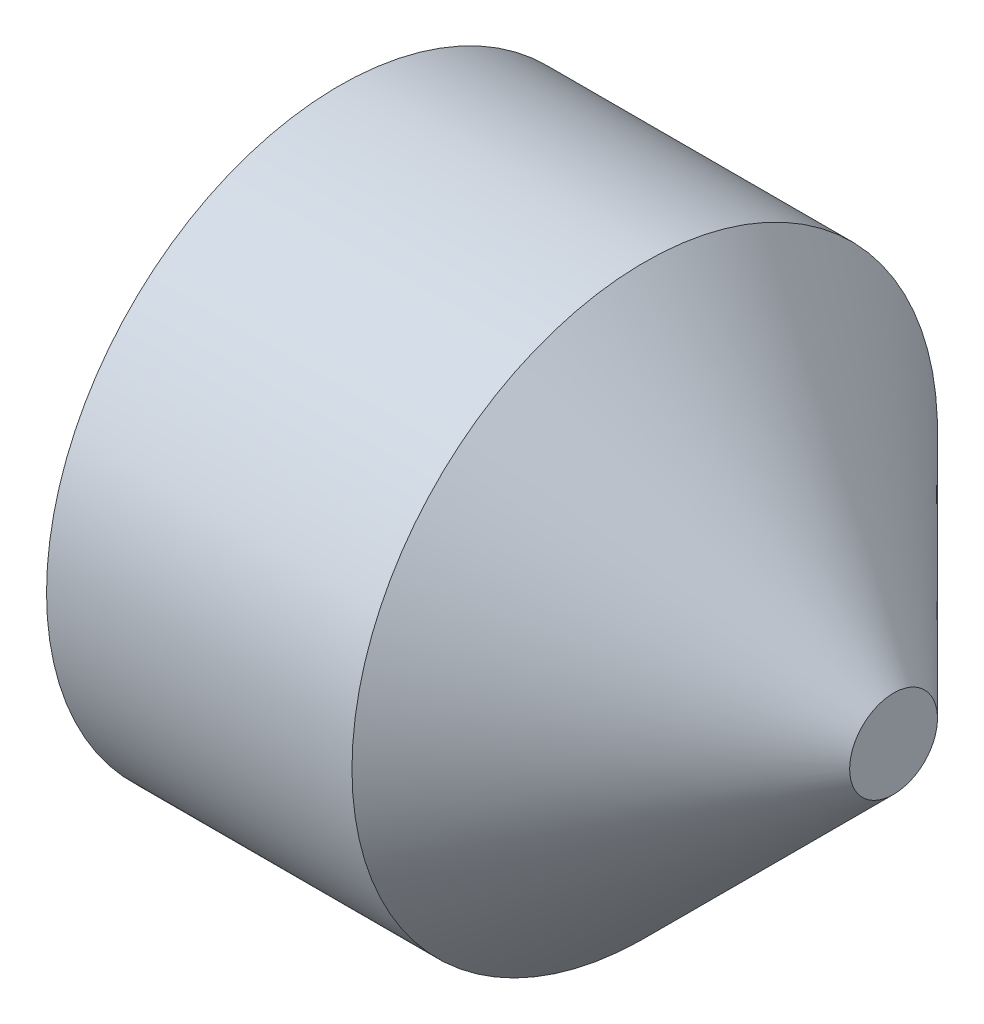
ISO-10303-21;
HEADER;
FILE_DESCRIPTION(('STEP AP214'),'2;1');
FILE_NAME('part.step','',(''),(''),'','','');
FILE_SCHEMA(('AUTOMOTIVE_DESIGN { 1 0 10303 214 1 1 1 1 }'));
ENDSEC;
DATA;
#1=APPLICATION_CONTEXT('core data for automotive mechanical design processes');
#2=APPLICATION_PROTOCOL_DEFINITION('international standard','automotive_design',2000,#1);
#3=PRODUCT_CONTEXT('',#1,'mechanical');
#4=PRODUCT('Part','Part','',(#3));
#5=PRODUCT_RELATED_PRODUCT_CATEGORY('part','',(#4));
#6=PRODUCT_DEFINITION_FORMATION('','',#4);
#7=PRODUCT_DEFINITION_CONTEXT('part definition',#1,'design');
#8=PRODUCT_DEFINITION('design','',#6,#7);
#9=PRODUCT_DEFINITION_SHAPE('','',#8);
#10=(LENGTH_UNIT() NAMED_UNIT(*) SI_UNIT(.MILLI.,.METRE.));
#11=(NAMED_UNIT(*) PLANE_ANGLE_UNIT() SI_UNIT($,.RADIAN.));
#12=(NAMED_UNIT(*) SI_UNIT($,.STERADIAN.) SOLID_ANGLE_UNIT());
#13=UNCERTAINTY_MEASURE_WITH_UNIT(LENGTH_MEASURE(1.E-05),#10,'distance_accuracy_value','');
#14=(GEOMETRIC_REPRESENTATION_CONTEXT(3) GLOBAL_UNCERTAINTY_ASSIGNED_CONTEXT((#13)) GLOBAL_UNIT_ASSIGNED_CONTEXT((#10,
#11,#12)) REPRESENTATION_CONTEXT('',''));
#15=CARTESIAN_POINT('',(0.,0.,0.));
#16=DIRECTION('',(0.,0.,1.));
#17=DIRECTION('',(1.,0.,0.));
#18=AXIS2_PLACEMENT_3D('',#15,#16,#17);
#19=CARTESIAN_POINT('',(0.,0.,0.));
#20=DIRECTION('',(-1.,0.,0.));
#21=DIRECTION('',(0.,0.,1.));
#22=AXIS2_PLACEMENT_3D('',#19,#20,#21);
#23=PLANE('',#22);
#24=CARTESIAN_POINT('',(0.,0.,0.));
#25=DIRECTION('',(-1.,0.,0.));
#26=DIRECTION('',(0.,0.,1.));
#27=AXIS2_PLACEMENT_3D('',#24,#25,#26);
#28=CIRCLE('',#27,2.4455);
#29=CARTESIAN_POINT('',(0.,0.,2.4455));
#30=VERTEX_POINT('',#29);
#31=EDGE_CURVE('E137',#30,#30,#28,.T.);
#32=ORIENTED_EDGE('',*,*,#31,.T.);
#33=EDGE_LOOP('',(#32));
#34=FACE_BOUND('',#33,.T.);
#35=DIRECTION('',(0.,0.,-1.));
#36=VECTOR('',#35,1.);
#37=CARTESIAN_POINT('',(0.,1.5,0.866025403784437));
#38=LINE('',#37,#36);
#39=CARTESIAN_POINT('',(0.,1.5,0.866025403784437));
#40=VERTEX_POINT('',#39);
#41=CARTESIAN_POINT('',(0.,1.5,-0.866025403784441));
#42=VERTEX_POINT('',#41);
#43=EDGE_CURVE('E128',#40,#42,#38,.T.);
#44=ORIENTED_EDGE('',*,*,#43,.F.);
#45=DIRECTION('',(0.,-0.866025403784439,0.5));
#46=VECTOR('',#45,1.);
#47=CARTESIAN_POINT('',(0.,1.5,0.866025403784437));
#48=LINE('',#47,#46);
#49=CARTESIAN_POINT('',(0.,0.,1.73205080756888));
#50=VERTEX_POINT('',#49);
#51=EDGE_CURVE('E50',#40,#50,#48,.T.);
#52=ORIENTED_EDGE('',*,*,#51,.T.);
#53=DIRECTION('',(0.,0.866025403784439,0.5));
#54=VECTOR('',#53,1.);
#55=CARTESIAN_POINT('',(0.,-1.5,0.866025403784437));
#56=LINE('',#55,#54);
#57=CARTESIAN_POINT('',(0.,-1.5,0.866025403784437));
#58=VERTEX_POINT('',#57);
#59=EDGE_CURVE('E119',#58,#50,#56,.T.);
#60=ORIENTED_EDGE('',*,*,#59,.F.);
#61=DIRECTION('',(0.,0.,-1.));
#62=VECTOR('',#61,1.);
#63=CARTESIAN_POINT('',(0.,-1.5,0.866025403784437));
#64=LINE('',#63,#62);
#65=CARTESIAN_POINT('',(0.,-1.5,-0.86602540378444));
#66=VERTEX_POINT('',#65);
#67=EDGE_CURVE('E122',#58,#66,#64,.T.);
#68=ORIENTED_EDGE('',*,*,#67,.T.);
#69=DIRECTION('',(0.,0.866025403784439,-0.5));
#70=VECTOR('',#69,1.);
#71=CARTESIAN_POINT('',(0.,-1.5,-0.86602540378444));
#72=LINE('',#71,#70);
#73=CARTESIAN_POINT('',(0.,0.,-1.73205080756888));
#74=VERTEX_POINT('',#73);
#75=EDGE_CURVE('E125',#66,#74,#72,.T.);
#76=ORIENTED_EDGE('',*,*,#75,.T.);
#77=DIRECTION('',(0.,-0.866025403784439,-0.5));
#78=VECTOR('',#77,1.);
#79=CARTESIAN_POINT('',(0.,1.5,-0.866025403784441));
#80=LINE('',#79,#78);
#81=EDGE_CURVE('E108',#42,#74,#80,.T.);
#82=ORIENTED_EDGE('',*,*,#81,.F.);
#83=EDGE_LOOP('',(#44,#52,#60,#68,#76,#82));
#84=FACE_BOUND('',#83,.T.);
#85=ADVANCED_FACE('F35',(#34,#84),#23,.T.);
#86=CARTESIAN_POINT('',(6.,0.45,0.));
#87=DIRECTION('',(1.,0.,0.));
#88=DIRECTION('',(0.,0.,-1.));
#89=AXIS2_PLACEMENT_3D('',#86,#87,#88);
#90=PLANE('',#89);
#91=CARTESIAN_POINT('',(6.,0.,0.));
#92=DIRECTION('',(-1.,0.,0.));
#93=DIRECTION('',(0.,0.,1.));
#94=AXIS2_PLACEMENT_3D('',#91,#92,#93);
#95=CIRCLE('',#94,0.45);
#96=CARTESIAN_POINT('',(6.,0.,0.449999999999999));
#97=VERTEX_POINT('',#96);
#98=EDGE_CURVE('E11',#97,#97,#95,.T.);
#99=ORIENTED_EDGE('',*,*,#98,.F.);
#100=EDGE_LOOP('',(#99));
#101=FACE_BOUND('',#100,.T.);
#102=ADVANCED_FACE('F37',(#101),#90,.T.);
#103=CARTESIAN_POINT('',(3.44999999999999,0.,0.));
#104=DIRECTION('',(-1.,0.,0.));
#105=DIRECTION('',(0.,0.,1.));
#106=AXIS2_PLACEMENT_3D('',#103,#104,#105);
#107=CONICAL_SURFACE('',#106,3.,0.785398163397447);
#108=CARTESIAN_POINT('',(3.44999999999999,0.,0.));
#109=DIRECTION('',(-1.,0.,0.));
#110=DIRECTION('',(0.,0.,1.));
#111=AXIS2_PLACEMENT_3D('',#108,#109,#110);
#112=CIRCLE('',#111,3.);
#113=CARTESIAN_POINT('',(3.44999999999999,0.,3.));
#114=VERTEX_POINT('',#113);
#115=EDGE_CURVE('E43',#114,#114,#112,.T.);
#116=CARTESIAN_POINT('',(6.,0.,0.449999999999999));
#117=CARTESIAN_POINT('',(5.9734375,0.,0.476562499999999));
#118=CARTESIAN_POINT('',(5.946875,0.,0.503124999999999));
#119=CARTESIAN_POINT('',(5.89375,0.,0.556249999999999));
#120=CARTESIAN_POINT('',(5.8671875,0.,0.582812499999999));
#121=CARTESIAN_POINT('',(5.8140625,0.,0.635937499999999));
#122=CARTESIAN_POINT('',(5.7875,0.,0.662499999999999));
#123=CARTESIAN_POINT('',(5.734375,0.,0.715624999999999));
#124=CARTESIAN_POINT('',(5.7078125,0.,0.742187499999999));
#125=CARTESIAN_POINT('',(5.6546875,0.,0.795312499999999));
#126=CARTESIAN_POINT('',(5.628125,0.,0.821874999999999));
#127=CARTESIAN_POINT('',(5.575,0.,0.874999999999999));
#128=CARTESIAN_POINT('',(5.5484375,0.,0.901562499999999));
#129=CARTESIAN_POINT('',(5.4953125,0.,0.954687499999999));
#130=CARTESIAN_POINT('',(5.46875,0.,0.981249999999999));
#131=CARTESIAN_POINT('',(5.415625,0.,1.034375));
#132=CARTESIAN_POINT('',(5.3890625,0.,1.0609375));
#133=CARTESIAN_POINT('',(5.3359375,0.,1.1140625));
#134=CARTESIAN_POINT('',(5.309375,0.,1.140625));
#135=CARTESIAN_POINT('',(5.25625,0.,1.19375));
#136=CARTESIAN_POINT('',(5.2296875,0.,1.2203125));
#137=CARTESIAN_POINT('',(5.1765625,0.,1.2734375));
#138=CARTESIAN_POINT('',(5.15,0.,1.3));
#139=CARTESIAN_POINT('',(5.096875,0.,1.353125));
#140=CARTESIAN_POINT('',(5.0703125,0.,1.3796875));
#141=CARTESIAN_POINT('',(5.0171875,0.,1.4328125));
#142=CARTESIAN_POINT('',(4.990625,0.,1.459375));
#143=CARTESIAN_POINT('',(4.9375,0.,1.5125));
#144=CARTESIAN_POINT('',(4.9109375,0.,1.5390625));
#145=CARTESIAN_POINT('',(4.8578125,0.,1.5921875));
#146=CARTESIAN_POINT('',(4.83125,0.,1.61875));
#147=CARTESIAN_POINT('',(4.778125,0.,1.671875));
#148=CARTESIAN_POINT('',(4.7515625,0.,1.6984375));
#149=CARTESIAN_POINT('',(4.6984375,0.,1.7515625));
#150=CARTESIAN_POINT('',(4.671875,0.,1.778125));
#151=CARTESIAN_POINT('',(4.61875,0.,1.83125));
#152=CARTESIAN_POINT('',(4.59218749999999,0.,1.8578125));
#153=CARTESIAN_POINT('',(4.5390625,0.,1.9109375));
#154=CARTESIAN_POINT('',(4.51249999999999,0.,1.9375));
#155=CARTESIAN_POINT('',(4.45937499999999,0.,1.990625));
#156=CARTESIAN_POINT('',(4.43281249999999,0.,2.0171875));
#157=CARTESIAN_POINT('',(4.37968749999999,0.,2.0703125));
#158=CARTESIAN_POINT('',(4.35312499999999,0.,2.096875));
#159=CARTESIAN_POINT('',(4.29999999999999,0.,2.15));
#160=CARTESIAN_POINT('',(4.27343749999999,0.,2.1765625));
#161=CARTESIAN_POINT('',(4.22031249999999,0.,2.2296875));
#162=CARTESIAN_POINT('',(4.19374999999999,0.,2.25625));
#163=CARTESIAN_POINT('',(4.14062499999999,0.,2.309375));
#164=CARTESIAN_POINT('',(4.11406249999999,0.,2.3359375));
#165=CARTESIAN_POINT('',(4.06093749999999,0.,2.3890625));
#166=CARTESIAN_POINT('',(4.03437499999999,0.,2.415625));
#167=CARTESIAN_POINT('',(3.98124999999999,0.,2.46875));
#168=CARTESIAN_POINT('',(3.95468749999999,0.,2.4953125));
#169=CARTESIAN_POINT('',(3.90156249999999,0.,2.5484375));
#170=CARTESIAN_POINT('',(3.87499999999999,0.,2.575));
#171=CARTESIAN_POINT('',(3.82187499999999,0.,2.628125));
#172=CARTESIAN_POINT('',(3.79531249999999,0.,2.6546875));
#173=CARTESIAN_POINT('',(3.74218749999999,0.,2.7078125));
#174=CARTESIAN_POINT('',(3.71562499999999,0.,2.734375));
#175=CARTESIAN_POINT('',(3.66249999999999,0.,2.7875));
#176=CARTESIAN_POINT('',(3.63593749999999,0.,2.8140625));
#177=CARTESIAN_POINT('',(3.58281249999999,0.,2.8671875));
#178=CARTESIAN_POINT('',(3.55624999999999,0.,2.89375));
#179=CARTESIAN_POINT('',(3.50312499999999,0.,2.946875));
#180=CARTESIAN_POINT('',(3.47656249999999,0.,2.9734375));
#181=CARTESIAN_POINT('',(3.44999999999999,0.,3.));
#182=B_SPLINE_CURVE_WITH_KNOTS('',3,(#116,#117,#118,#119,#120,#121,#122,#123,#124,#125,#126,
#127,#128,#129,#130,#131,#132,#133,#134,#135,#136,#137,#138,#139,#140,#141,#142,#143,#144,#145,
#146,#147,#148,#149,#150,#151,#152,#153,#154,#155,#156,#157,#158,#159,#160,#161,#162,#163,#164,
#165,#166,#167,#168,#169,#170,#171,#172,#173,#174,#175,#176,#177,#178,#179,#180,#181),
.UNSPECIFIED.,.F.,.F.,(4,2,2,2,2,2,2,2,2,2,2,2,2,2,2,2,2,2,2,2,2,2,2,2,2,2,2,2,2,2,2,2,4),(0.,
0.112695143251606,0.225390286503213,0.338085429754818,0.450780573006424,0.563475716258031,
0.676170859509638,0.788866002761244,0.901561146012849,1.01425628926446,1.12695143251606,
1.23964657576767,1.35234171901927,1.46503686227088,1.57773200552249,1.69042714877409,
1.8031222920257,1.91581743527731,2.02851257852891,2.14120772178052,2.25390286503212,
2.36659800828373,2.47929315153534,2.59198829478694,2.70468343803855,2.81737858129016,
2.93007372454176,3.04276886779337,3.15546401104497,3.26815915429658,3.38085429754819,
3.49354944079979,3.6062445840514),.UNSPECIFIED.);
#183=EDGE_CURVE('BSEAM148',#97,#114,#182,.T.);
#184=ORIENTED_EDGE('',*,*,#98,.T.);
#185=ORIENTED_EDGE('',*,*,#115,.F.);
#186=ORIENTED_EDGE('',*,*,#183,.T.);
#187=ORIENTED_EDGE('',*,*,#183,.F.);
#188=EDGE_LOOP('',(#184,#186,#185,#187));
#189=FACE_BOUND('',#188,.T.);
#190=ADVANCED_FACE('F148',(#189),#107,.T.);
#191=CARTESIAN_POINT('',(-12.7,0.,0.));
#192=DIRECTION('',(-1.,0.,0.));
#193=DIRECTION('',(0.,0.,1.));
#194=AXIS2_PLACEMENT_3D('',#191,#192,#193);
#195=CYLINDRICAL_SURFACE('',#194,3.);
#196=ORIENTED_EDGE('',*,*,#115,.T.);
#197=EDGE_LOOP('',(#196));
#198=FACE_BOUND('',#197,.T.);
#199=CARTESIAN_POINT('',(0.320140724265646,0.,0.));
#200=DIRECTION('',(-1.,0.,0.));
#201=DIRECTION('',(0.,0.,1.));
#202=AXIS2_PLACEMENT_3D('',#199,#200,#201);
#203=CIRCLE('',#202,3.);
#204=CARTESIAN_POINT('',(0.320140724265646,0.,3.));
#205=VERTEX_POINT('',#204);
#206=EDGE_CURVE('E140',#205,#205,#203,.T.);
#207=ORIENTED_EDGE('',*,*,#206,.F.);
#208=EDGE_LOOP('',(#207));
#209=FACE_BOUND('',#208,.T.);
#210=ADVANCED_FACE('F145',(#198,#209),#195,.T.);
#211=CARTESIAN_POINT('',(0.,0.,0.));
#212=DIRECTION('',(1.,0.,0.));
#213=DIRECTION('',(0.,0.,-1.));
#214=AXIS2_PLACEMENT_3D('',#211,#212,#213);
#215=CONICAL_SURFACE('',#214,2.4455,1.0471975511966);
#216=ORIENTED_EDGE('',*,*,#206,.T.);
#217=EDGE_LOOP('',(#216));
#218=FACE_BOUND('',#217,.T.);
#219=ORIENTED_EDGE('',*,*,#31,.F.);
#220=EDGE_LOOP('',(#219));
#221=FACE_BOUND('',#220,.T.);
#222=ADVANCED_FACE('F155',(#218,#221),#215,.T.);
#223=CARTESIAN_POINT('',(3.5,1.5,0.866025403784437));
#224=DIRECTION('',(0.,-0.5,-0.866025403784438));
#225=DIRECTION('',(0.,0.866025403784439,-0.5));
#226=AXIS2_PLACEMENT_3D('',#223,#224,#225);
#227=PLANE('',#226);
#228=ORIENTED_EDGE('',*,*,#51,.F.);
#229=DIRECTION('',(-1.,0.,0.));
#230=VECTOR('',#229,1.);
#231=CARTESIAN_POINT('',(3.5,1.5,0.866025403784437));
#232=LINE('',#231,#230);
#233=CARTESIAN_POINT('',(3.5,1.5,0.866025403784437));
#234=VERTEX_POINT('',#233);
#235=EDGE_CURVE('E55',#234,#40,#232,.T.);
#236=ORIENTED_EDGE('',*,*,#235,.F.);
#237=DIRECTION('',(0.,-0.866025403784439,0.5));
#238=VECTOR('',#237,1.);
#239=CARTESIAN_POINT('',(3.5,1.5,0.866025403784437));
#240=LINE('',#239,#238);
#241=CARTESIAN_POINT('',(3.5,0.,1.73205080756888));
#242=VERTEX_POINT('',#241);
#243=EDGE_CURVE('E82',#234,#242,#240,.T.);
#244=ORIENTED_EDGE('',*,*,#243,.T.);
#245=DIRECTION('',(-1.,0.,0.));
#246=VECTOR('',#245,1.);
#247=CARTESIAN_POINT('',(3.5,0.,1.73205080756888));
#248=LINE('',#247,#246);
#249=EDGE_CURVE('E135',#242,#50,#248,.T.);
#250=ORIENTED_EDGE('',*,*,#249,.T.);
#251=EDGE_LOOP('',(#228,#236,#244,#250));
#252=FACE_BOUND('',#251,.T.);
#253=ADVANCED_FACE('F166',(#252),#227,.T.);
#254=CARTESIAN_POINT('',(3.5,-1.5,0.866025403784437));
#255=DIRECTION('',(0.,-0.5,0.866025403784439));
#256=DIRECTION('',(0.,-0.866025403784439,-0.5));
#257=AXIS2_PLACEMENT_3D('',#254,#255,#256);
#258=PLANE('',#257);
#259=ORIENTED_EDGE('',*,*,#59,.T.);
#260=ORIENTED_EDGE('',*,*,#249,.F.);
#261=DIRECTION('',(0.,0.866025403784439,0.5));
#262=VECTOR('',#261,1.);
#263=CARTESIAN_POINT('',(3.5,-1.5,0.866025403784437));
#264=LINE('',#263,#262);
#265=CARTESIAN_POINT('',(3.5,-1.5,0.866025403784437));
#266=VERTEX_POINT('',#265);
#267=EDGE_CURVE('E266',#266,#242,#264,.T.);
#268=ORIENTED_EDGE('',*,*,#267,.F.);
#269=DIRECTION('',(-1.,0.,0.));
#270=VECTOR('',#269,1.);
#271=CARTESIAN_POINT('',(3.5,-1.5,0.866025403784437));
#272=LINE('',#271,#270);
#273=EDGE_CURVE('E133',#266,#58,#272,.T.);
#274=ORIENTED_EDGE('',*,*,#273,.T.);
#275=EDGE_LOOP('',(#259,#260,#268,#274));
#276=FACE_BOUND('',#275,.T.);
#277=ADVANCED_FACE('F173',(#276),#258,.F.);
#278=CARTESIAN_POINT('',(3.5,-1.5,0.866025403784437));
#279=DIRECTION('',(0.,1.,0.));
#280=DIRECTION('',(0.,0.,1.));
#281=AXIS2_PLACEMENT_3D('',#278,#279,#280);
#282=PLANE('',#281);
#283=ORIENTED_EDGE('',*,*,#67,.F.);
#284=ORIENTED_EDGE('',*,*,#273,.F.);
#285=DIRECTION('',(0.,0.,-1.));
#286=VECTOR('',#285,1.);
#287=CARTESIAN_POINT('',(3.5,-1.5,0.866025403784437));
#288=LINE('',#287,#286);
#289=CARTESIAN_POINT('',(3.5,-1.5,-0.86602540378444));
#290=VERTEX_POINT('',#289);
#291=EDGE_CURVE('E103',#266,#290,#288,.T.);
#292=ORIENTED_EDGE('',*,*,#291,.T.);
#293=DIRECTION('',(-1.,0.,0.));
#294=VECTOR('',#293,1.);
#295=CARTESIAN_POINT('',(3.5,-1.5,-0.86602540378444));
#296=LINE('',#295,#294);
#297=EDGE_CURVE('E98',#290,#66,#296,.T.);
#298=ORIENTED_EDGE('',*,*,#297,.T.);
#299=EDGE_LOOP('',(#283,#284,#292,#298));
#300=FACE_BOUND('',#299,.T.);
#301=ADVANCED_FACE('F180',(#300),#282,.T.);
#302=CARTESIAN_POINT('',(3.5,-1.5,-0.86602540378444));
#303=DIRECTION('',(0.,0.5,0.866025403784439));
#304=DIRECTION('',(0.,-0.866025403784439,0.5));
#305=AXIS2_PLACEMENT_3D('',#302,#303,#304);
#306=PLANE('',#305);
#307=ORIENTED_EDGE('',*,*,#75,.F.);
#308=ORIENTED_EDGE('',*,*,#297,.F.);
#309=DIRECTION('',(0.,0.866025403784439,-0.5));
#310=VECTOR('',#309,1.);
#311=CARTESIAN_POINT('',(3.5,-1.5,-0.86602540378444));
#312=LINE('',#311,#310);
#313=CARTESIAN_POINT('',(3.5,0.,-1.73205080756888));
#314=VERTEX_POINT('',#313);
#315=EDGE_CURVE('E93',#290,#314,#312,.T.);
#316=ORIENTED_EDGE('',*,*,#315,.T.);
#317=DIRECTION('',(-1.,0.,0.));
#318=VECTOR('',#317,1.);
#319=CARTESIAN_POINT('',(3.5,0.,-1.73205080756888));
#320=LINE('',#319,#318);
#321=EDGE_CURVE('E97',#314,#74,#320,.T.);
#322=ORIENTED_EDGE('',*,*,#321,.T.);
#323=EDGE_LOOP('',(#307,#308,#316,#322));
#324=FACE_BOUND('',#323,.T.);
#325=ADVANCED_FACE('F96',(#324),#306,.T.);
#326=CARTESIAN_POINT('',(3.5,1.5,-0.866025403784441));
#327=DIRECTION('',(0.,0.5,-0.866025403784439));
#328=DIRECTION('',(0.,0.866025403784439,0.5));
#329=AXIS2_PLACEMENT_3D('',#326,#327,#328);
#330=PLANE('',#329);
#331=ORIENTED_EDGE('',*,*,#81,.T.);
#332=ORIENTED_EDGE('',*,*,#321,.F.);
#333=DIRECTION('',(0.,-0.866025403784439,-0.5));
#334=VECTOR('',#333,1.);
#335=CARTESIAN_POINT('',(3.5,1.5,-0.866025403784441));
#336=LINE('',#335,#334);
#337=CARTESIAN_POINT('',(3.5,1.5,-0.866025403784441));
#338=VERTEX_POINT('',#337);
#339=EDGE_CURVE('E102',#338,#314,#336,.T.);
#340=ORIENTED_EDGE('',*,*,#339,.F.);
#341=DIRECTION('',(-1.,0.,0.));
#342=VECTOR('',#341,1.);
#343=CARTESIAN_POINT('',(3.5,1.5,-0.866025403784441));
#344=LINE('',#343,#342);
#345=EDGE_CURVE('E78',#338,#42,#344,.T.);
#346=ORIENTED_EDGE('',*,*,#345,.T.);
#347=EDGE_LOOP('',(#331,#332,#340,#346));
#348=FACE_BOUND('',#347,.T.);
#349=ADVANCED_FACE('F105',(#348),#330,.F.);
#350=CARTESIAN_POINT('',(3.5,1.5,0.866025403784437));
#351=DIRECTION('',(0.,1.,0.));
#352=DIRECTION('',(0.,0.,1.));
#353=AXIS2_PLACEMENT_3D('',#350,#351,#352);
#354=PLANE('',#353);
#355=ORIENTED_EDGE('',*,*,#43,.T.);
#356=ORIENTED_EDGE('',*,*,#345,.F.);
#357=DIRECTION('',(0.,0.,-1.));
#358=VECTOR('',#357,1.);
#359=CARTESIAN_POINT('',(3.5,1.5,0.866025403784437));
#360=LINE('',#359,#358);
#361=EDGE_CURVE('E113',#234,#338,#360,.T.);
#362=ORIENTED_EDGE('',*,*,#361,.F.);
#363=ORIENTED_EDGE('',*,*,#235,.T.);
#364=EDGE_LOOP('',(#355,#356,#362,#363));
#365=FACE_BOUND('',#364,.T.);
#366=ADVANCED_FACE('F192',(#365),#354,.F.);
#367=CARTESIAN_POINT('',(3.5,3.,0.));
#368=DIRECTION('',(1.,0.,0.));
#369=DIRECTION('',(0.,0.,-1.));
#370=AXIS2_PLACEMENT_3D('',#367,#368,#369);
#371=PLANE('',#370);
#372=ORIENTED_EDGE('',*,*,#243,.F.);
#373=ORIENTED_EDGE('',*,*,#361,.T.);
#374=ORIENTED_EDGE('',*,*,#339,.T.);
#375=ORIENTED_EDGE('',*,*,#315,.F.);
#376=ORIENTED_EDGE('',*,*,#291,.F.);
#377=ORIENTED_EDGE('',*,*,#267,.T.);
#378=EDGE_LOOP('',(#372,#373,#374,#375,#376,#377));
#379=FACE_BOUND('',#378,.T.);
#380=ADVANCED_FACE('F111',(#379),#371,.F.);
#381=CLOSED_SHELL('',(#85,#102,#190,#210,#222,#253,#277,#301,#325,#349,#366,#380));
#382=MANIFOLD_SOLID_BREP('B2',#381);
#383=ADVANCED_BREP_SHAPE_REPRESENTATION('',(#18,#382),#14);
#384=SHAPE_DEFINITION_REPRESENTATION(#9,#383);
ENDSEC;
END-ISO-10303-21;
